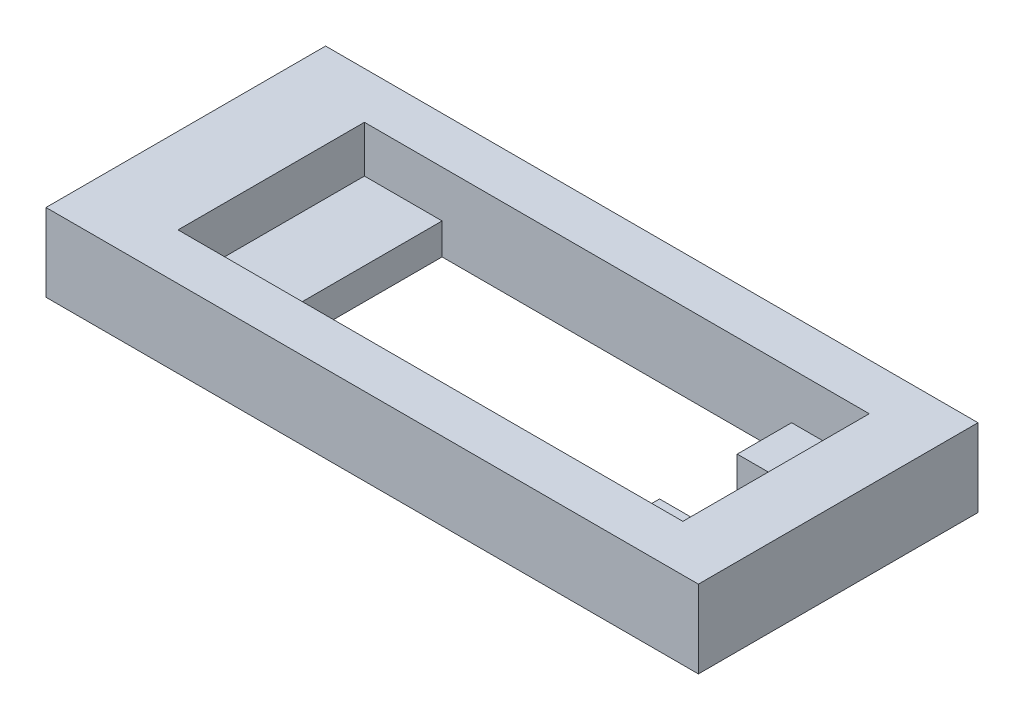
ISO-10303-21;
HEADER;
FILE_DESCRIPTION(('STEP AP214'),'2;1');
FILE_NAME('part.step','',(''),(''),'','','');
FILE_SCHEMA(('AUTOMOTIVE_DESIGN { 1 0 10303 214 1 1 1 1 }'));
ENDSEC;
DATA;
#1=APPLICATION_CONTEXT('core data for automotive mechanical design processes');
#2=APPLICATION_PROTOCOL_DEFINITION('international standard','automotive_design',2000,#1);
#3=PRODUCT_CONTEXT('',#1,'mechanical');
#4=PRODUCT('Part','Part','',(#3));
#5=PRODUCT_RELATED_PRODUCT_CATEGORY('part','',(#4));
#6=PRODUCT_DEFINITION_FORMATION('','',#4);
#7=PRODUCT_DEFINITION_CONTEXT('part definition',#1,'design');
#8=PRODUCT_DEFINITION('design','',#6,#7);
#9=PRODUCT_DEFINITION_SHAPE('','',#8);
#10=(LENGTH_UNIT() NAMED_UNIT(*) SI_UNIT(.MILLI.,.METRE.));
#11=(NAMED_UNIT(*) PLANE_ANGLE_UNIT() SI_UNIT($,.RADIAN.));
#12=(NAMED_UNIT(*) SI_UNIT($,.STERADIAN.) SOLID_ANGLE_UNIT());
#13=UNCERTAINTY_MEASURE_WITH_UNIT(LENGTH_MEASURE(1.E-05),#10,'distance_accuracy_value','');
#14=(GEOMETRIC_REPRESENTATION_CONTEXT(3) GLOBAL_UNCERTAINTY_ASSIGNED_CONTEXT((#13)) GLOBAL_UNIT_ASSIGNED_CONTEXT((#10,
#11,#12)) REPRESENTATION_CONTEXT('',''));
#15=CARTESIAN_POINT('',(0.,0.,0.));
#16=DIRECTION('',(0.,0.,1.));
#17=DIRECTION('',(1.,0.,0.));
#18=AXIS2_PLACEMENT_3D('',#15,#16,#17);
#19=CARTESIAN_POINT('',(0.,-3.,0.));
#20=DIRECTION('',(0.,-1.,0.));
#21=DIRECTION('',(1.,0.,0.));
#22=AXIS2_PLACEMENT_3D('',#19,#20,#21);
#23=PLANE('',#22);
#24=DIRECTION('',(0.,0.,-1.));
#25=VECTOR('',#24,1.);
#26=CARTESIAN_POINT('',(12.,-3.,3.));
#27=LINE('',#26,#25);
#28=CARTESIAN_POINT('',(12.,-3.,6.50000000000001));
#29=VERTEX_POINT('',#28);
#30=CARTESIAN_POINT('',(12.,-3.,3.));
#31=VERTEX_POINT('',#30);
#32=EDGE_CURVE('E185',#29,#31,#27,.T.);
#33=ORIENTED_EDGE('',*,*,#32,.F.);
#34=DIRECTION('',(-1.,0.,0.));
#35=VECTOR('',#34,1.);
#36=CARTESIAN_POINT('',(17.,-3.,6.50000000000001));
#37=LINE('',#36,#35);
#38=CARTESIAN_POINT('',(17.,-3.,6.50000000000001));
#39=VERTEX_POINT('',#38);
#40=EDGE_CURVE('E168',#39,#29,#37,.T.);
#41=ORIENTED_EDGE('',*,*,#40,.F.);
#42=DIRECTION('',(0.,0.,-1.));
#43=VECTOR('',#42,1.);
#44=CARTESIAN_POINT('',(17.,-3.,3.));
#45=LINE('',#44,#43);
#46=CARTESIAN_POINT('',(17.,-3.,3.));
#47=VERTEX_POINT('',#46);
#48=EDGE_CURVE('E220',#39,#47,#45,.T.);
#49=ORIENTED_EDGE('',*,*,#48,.T.);
#50=DIRECTION('',(-1.,0.,0.));
#51=VECTOR('',#50,1.);
#52=CARTESIAN_POINT('',(17.,-3.,3.));
#53=LINE('',#52,#51);
#54=EDGE_CURVE('E224',#47,#31,#53,.T.);
#55=ORIENTED_EDGE('',*,*,#54,.T.);
#56=EDGE_LOOP('',(#33,#41,#49,#55));
#57=FACE_BOUND('',#56,.T.);
#58=ADVANCED_FACE('F45',(#57),#23,.F.);
#59=CARTESIAN_POINT('',(12.,-5.00907777029563,3.));
#60=DIRECTION('',(1.,0.,0.));
#61=DIRECTION('',(0.,0.,-1.));
#62=AXIS2_PLACEMENT_3D('',#59,#60,#61);
#63=PLANE('',#62);
#64=DIRECTION('',(0.,0.,1.));
#65=VECTOR('',#64,1.);
#66=CARTESIAN_POINT('',(12.,-5.00807777029562,3.));
#67=LINE('',#66,#65);
#68=CARTESIAN_POINT('',(12.,-5.00807777029562,3.));
#69=VERTEX_POINT('',#68);
#70=CARTESIAN_POINT('',(12.,-5.00807777029562,6.50000000000001));
#71=VERTEX_POINT('',#70);
#72=EDGE_CURVE('E191',#69,#71,#67,.T.);
#73=ORIENTED_EDGE('',*,*,#72,.T.);
#74=DIRECTION('',(0.,1.,0.));
#75=VECTOR('',#74,1.);
#76=CARTESIAN_POINT('',(12.,-5.00907777029563,6.50000000000001));
#77=LINE('',#76,#75);
#78=EDGE_CURVE('E555',#71,#29,#77,.T.);
#79=ORIENTED_EDGE('',*,*,#78,.T.);
#80=ORIENTED_EDGE('',*,*,#32,.T.);
#81=DIRECTION('',(0.,1.,0.));
#82=VECTOR('',#81,1.);
#83=CARTESIAN_POINT('',(12.,-5.00907777029563,3.));
#84=LINE('',#83,#82);
#85=EDGE_CURVE('E189',#69,#31,#84,.T.);
#86=ORIENTED_EDGE('',*,*,#85,.F.);
#87=EDGE_LOOP('',(#73,#79,#80,#86));
#88=FACE_BOUND('',#87,.T.);
#89=ADVANCED_FACE('F320',(#88),#63,.F.);
#90=CARTESIAN_POINT('',(17.,-3.,15.));
#91=VERTEX_POINT('',#90);
#92=CARTESIAN_POINT('',(17.,-3.,11.5));
#93=VERTEX_POINT('',#92);
#94=EDGE_CURVE('E176',#91,#93,#45,.T.);
#95=ORIENTED_EDGE('',*,*,#94,.T.);
#96=DIRECTION('',(1.,0.,0.));
#97=VECTOR('',#96,1.);
#98=CARTESIAN_POINT('',(17.,-3.,11.5));
#99=LINE('',#98,#97);
#100=CARTESIAN_POINT('',(12.,-3.,11.5));
#101=VERTEX_POINT('',#100);
#102=EDGE_CURVE('E161',#101,#93,#99,.T.);
#103=ORIENTED_EDGE('',*,*,#102,.F.);
#104=CARTESIAN_POINT('',(12.,-3.,15.));
#105=VERTEX_POINT('',#104);
#106=EDGE_CURVE('E173',#105,#101,#27,.T.);
#107=ORIENTED_EDGE('',*,*,#106,.F.);
#108=DIRECTION('',(1.,0.,0.));
#109=VECTOR('',#108,1.);
#110=CARTESIAN_POINT('',(17.,-3.,15.));
#111=LINE('',#110,#109);
#112=EDGE_CURVE('E214',#105,#91,#111,.T.);
#113=ORIENTED_EDGE('',*,*,#112,.T.);
#114=EDGE_LOOP('',(#95,#103,#107,#113));
#115=FACE_BOUND('',#114,.T.);
#116=ADVANCED_FACE('F172',(#115),#23,.F.);
#117=DIRECTION('',(0.,0.,1.));
#118=VECTOR('',#117,1.);
#119=CARTESIAN_POINT('',(-10.5,-3.,3.));
#120=LINE('',#119,#118);
#121=CARTESIAN_POINT('',(-10.5,-3.,3.));
#122=VERTEX_POINT('',#121);
#123=CARTESIAN_POINT('',(-10.5,-3.,15.));
#124=VERTEX_POINT('',#123);
#125=EDGE_CURVE('E184',#122,#124,#120,.T.);
#126=ORIENTED_EDGE('',*,*,#125,.F.);
#127=CARTESIAN_POINT('',(-15.5,-3.,3.));
#128=VERTEX_POINT('',#127);
#129=EDGE_CURVE('E223',#122,#128,#53,.T.);
#130=ORIENTED_EDGE('',*,*,#129,.T.);
#131=DIRECTION('',(0.,0.,1.));
#132=VECTOR('',#131,1.);
#133=CARTESIAN_POINT('',(-15.5,-3.,3.));
#134=LINE('',#133,#132);
#135=CARTESIAN_POINT('',(-15.5,-3.,15.));
#136=VERTEX_POINT('',#135);
#137=EDGE_CURVE('E210',#128,#136,#134,.T.);
#138=ORIENTED_EDGE('',*,*,#137,.T.);
#139=EDGE_CURVE('E216',#136,#124,#111,.T.);
#140=ORIENTED_EDGE('',*,*,#139,.T.);
#141=EDGE_LOOP('',(#126,#130,#138,#140));
#142=FACE_BOUND('',#141,.T.);
#143=ADVANCED_FACE('F317',(#142),#23,.F.);
#144=CARTESIAN_POINT('',(21.,0.,18.));
#145=DIRECTION('',(0.,-1.,0.));
#146=DIRECTION('',(1.,0.,0.));
#147=AXIS2_PLACEMENT_3D('',#144,#145,#146);
#148=PLANE('',#147);
#149=DIRECTION('',(1.,0.,0.));
#150=VECTOR('',#149,1.);
#151=CARTESIAN_POINT('',(17.,0.,15.));
#152=LINE('',#151,#150);
#153=CARTESIAN_POINT('',(-15.5,0.,15.));
#154=VERTEX_POINT('',#153);
#155=CARTESIAN_POINT('',(17.,0.,15.));
#156=VERTEX_POINT('',#155);
#157=EDGE_CURVE('E231',#154,#156,#152,.T.);
#158=ORIENTED_EDGE('',*,*,#157,.F.);
#159=DIRECTION('',(0.,0.,1.));
#160=VECTOR('',#159,1.);
#161=CARTESIAN_POINT('',(-15.5,0.,3.));
#162=LINE('',#161,#160);
#163=CARTESIAN_POINT('',(-15.5,0.,3.));
#164=VERTEX_POINT('',#163);
#165=EDGE_CURVE('E209',#164,#154,#162,.T.);
#166=ORIENTED_EDGE('',*,*,#165,.F.);
#167=DIRECTION('',(-1.,0.,0.));
#168=VECTOR('',#167,1.);
#169=CARTESIAN_POINT('',(17.,0.,3.));
#170=LINE('',#169,#168);
#171=CARTESIAN_POINT('',(17.,0.,3.));
#172=VERTEX_POINT('',#171);
#173=EDGE_CURVE('E215',#172,#164,#170,.T.);
#174=ORIENTED_EDGE('',*,*,#173,.F.);
#175=DIRECTION('',(0.,0.,-1.));
#176=VECTOR('',#175,1.);
#177=CARTESIAN_POINT('',(17.,0.,3.));
#178=LINE('',#177,#176);
#179=EDGE_CURVE('E235',#156,#172,#178,.T.);
#180=ORIENTED_EDGE('',*,*,#179,.F.);
#181=EDGE_LOOP('',(#158,#166,#174,#180));
#182=FACE_BOUND('',#181,.T.);
#183=DIRECTION('',(-1.,0.,0.));
#184=VECTOR('',#183,1.);
#185=CARTESIAN_POINT('',(21.,0.,0.));
#186=LINE('',#185,#184);
#187=CARTESIAN_POINT('',(21.,0.,0.));
#188=VERTEX_POINT('',#187);
#189=CARTESIAN_POINT('',(-21.,0.,0.));
#190=VERTEX_POINT('',#189);
#191=EDGE_CURVE('E245',#188,#190,#186,.T.);
#192=ORIENTED_EDGE('',*,*,#191,.T.);
#193=DIRECTION('',(0.,0.,-1.));
#194=VECTOR('',#193,1.);
#195=CARTESIAN_POINT('',(-21.,0.,18.));
#196=LINE('',#195,#194);
#197=CARTESIAN_POINT('',(-21.,0.,18.));
#198=VERTEX_POINT('',#197);
#199=EDGE_CURVE('E11',#198,#190,#196,.T.);
#200=ORIENTED_EDGE('',*,*,#199,.F.);
#201=DIRECTION('',(-1.,0.,0.));
#202=VECTOR('',#201,1.);
#203=CARTESIAN_POINT('',(21.,0.,18.));
#204=LINE('',#203,#202);
#205=CARTESIAN_POINT('',(21.,0.,18.));
#206=VERTEX_POINT('',#205);
#207=EDGE_CURVE('E255',#206,#198,#204,.T.);
#208=ORIENTED_EDGE('',*,*,#207,.F.);
#209=DIRECTION('',(0.,0.,-1.));
#210=VECTOR('',#209,1.);
#211=CARTESIAN_POINT('',(21.,0.,18.));
#212=LINE('',#211,#210);
#213=EDGE_CURVE('E269',#206,#188,#212,.T.);
#214=ORIENTED_EDGE('',*,*,#213,.T.);
#215=EDGE_LOOP('',(#192,#200,#208,#214));
#216=FACE_BOUND('',#215,.T.);
#217=ADVANCED_FACE('F47',(#182,#216),#148,.F.);
#218=CARTESIAN_POINT('',(-21.,0.,18.));
#219=DIRECTION('',(1.,0.,0.));
#220=DIRECTION('',(0.,1.,0.));
#221=AXIS2_PLACEMENT_3D('',#218,#219,#220);
#222=PLANE('',#221);
#223=DIRECTION('',(0.,-1.,0.));
#224=VECTOR('',#223,1.);
#225=CARTESIAN_POINT('',(-21.,0.,0.));
#226=LINE('',#225,#224);
#227=CARTESIAN_POINT('',(-21.,-5.00807777029563,0.));
#228=VERTEX_POINT('',#227);
#229=EDGE_CURVE('E273',#190,#228,#226,.T.);
#230=ORIENTED_EDGE('',*,*,#229,.T.);
#231=DIRECTION('',(0.,0.,-1.));
#232=VECTOR('',#231,1.);
#233=CARTESIAN_POINT('',(-21.,-5.00807777029563,18.));
#234=LINE('',#233,#232);
#235=CARTESIAN_POINT('',(-21.,-5.00807777029563,18.));
#236=VERTEX_POINT('',#235);
#237=EDGE_CURVE('E54',#236,#228,#234,.T.);
#238=ORIENTED_EDGE('',*,*,#237,.F.);
#239=DIRECTION('',(0.,-1.,0.));
#240=VECTOR('',#239,1.);
#241=CARTESIAN_POINT('',(-21.,0.,18.));
#242=LINE('',#241,#240);
#243=EDGE_CURVE('E259',#198,#236,#242,.T.);
#244=ORIENTED_EDGE('',*,*,#243,.F.);
#245=ORIENTED_EDGE('',*,*,#199,.T.);
#246=EDGE_LOOP('',(#230,#238,#244,#245));
#247=FACE_BOUND('',#246,.T.);
#248=ADVANCED_FACE('F309',(#247),#222,.F.);
#249=CARTESIAN_POINT('',(-21.,-5.00807777029563,18.));
#250=DIRECTION('',(0.,1.,0.));
#251=DIRECTION('',(-1.,0.,0.));
#252=AXIS2_PLACEMENT_3D('',#249,#250,#251);
#253=PLANE('',#252);
#254=DIRECTION('',(0.,0.,1.));
#255=VECTOR('',#254,1.);
#256=CARTESIAN_POINT('',(17.,-5.00807777029562,6.50000000000001));
#257=LINE('',#256,#255);
#258=CARTESIAN_POINT('',(17.,-5.00807777029562,6.50000000000001));
#259=VERTEX_POINT('',#258);
#260=CARTESIAN_POINT('',(17.,-5.00807777029562,11.5));
#261=VERTEX_POINT('',#260);
#262=EDGE_CURVE('E559',#259,#261,#257,.T.);
#263=ORIENTED_EDGE('',*,*,#262,.F.);
#264=DIRECTION('',(1.,0.,0.));
#265=VECTOR('',#264,1.);
#266=CARTESIAN_POINT('',(17.,-5.00807777029562,6.50000000000001));
#267=LINE('',#266,#265);
#268=EDGE_CURVE('E178',#71,#259,#267,.T.);
#269=ORIENTED_EDGE('',*,*,#268,.F.);
#270=ORIENTED_EDGE('',*,*,#72,.F.);
#271=DIRECTION('',(1.,0.,0.));
#272=VECTOR('',#271,1.);
#273=CARTESIAN_POINT('',(-10.5,-5.00807777029563,3.));
#274=LINE('',#273,#272);
#275=CARTESIAN_POINT('',(-10.5,-5.00807777029563,3.));
#276=VERTEX_POINT('',#275);
#277=EDGE_CURVE('E197',#276,#69,#274,.T.);
#278=ORIENTED_EDGE('',*,*,#277,.F.);
#279=DIRECTION('',(0.,0.,-1.));
#280=VECTOR('',#279,1.);
#281=CARTESIAN_POINT('',(-10.5,-5.00807777029563,3.));
#282=LINE('',#281,#280);
#283=CARTESIAN_POINT('',(-10.5,-5.00807777029563,15.));
#284=VERTEX_POINT('',#283);
#285=EDGE_CURVE('E575',#284,#276,#282,.T.);
#286=ORIENTED_EDGE('',*,*,#285,.F.);
#287=DIRECTION('',(-1.,0.,0.));
#288=VECTOR('',#287,1.);
#289=CARTESIAN_POINT('',(-10.5,-5.00807777029563,15.));
#290=LINE('',#289,#288);
#291=CARTESIAN_POINT('',(12.,-5.00807777029562,15.));
#292=VERTEX_POINT('',#291);
#293=EDGE_CURVE('E577',#292,#284,#290,.T.);
#294=ORIENTED_EDGE('',*,*,#293,.F.);
#295=CARTESIAN_POINT('',(12.,-5.00807777029562,11.5));
#296=VERTEX_POINT('',#295);
#297=EDGE_CURVE('E580',#296,#292,#67,.T.);
#298=ORIENTED_EDGE('',*,*,#297,.F.);
#299=DIRECTION('',(-1.,0.,0.));
#300=VECTOR('',#299,1.);
#301=CARTESIAN_POINT('',(17.,-5.00807777029562,11.5));
#302=LINE('',#301,#300);
#303=EDGE_CURVE('E61',#261,#296,#302,.T.);
#304=ORIENTED_EDGE('',*,*,#303,.F.);
#305=EDGE_LOOP('',(#263,#269,#270,#278,#286,#294,#298,#304));
#306=FACE_BOUND('',#305,.T.);
#307=DIRECTION('',(1.,0.,0.));
#308=VECTOR('',#307,1.);
#309=CARTESIAN_POINT('',(-21.,-5.00807777029563,0.));
#310=LINE('',#309,#308);
#311=CARTESIAN_POINT('',(21.,-5.00807777029562,0.));
#312=VERTEX_POINT('',#311);
#313=EDGE_CURVE('E276',#228,#312,#310,.T.);
#314=ORIENTED_EDGE('',*,*,#313,.T.);
#315=DIRECTION('',(0.,0.,-1.));
#316=VECTOR('',#315,1.);
#317=CARTESIAN_POINT('',(21.,-5.00807777029562,18.));
#318=LINE('',#317,#316);
#319=CARTESIAN_POINT('',(21.,-5.00807777029562,18.));
#320=VERTEX_POINT('',#319);
#321=EDGE_CURVE('E284',#320,#312,#318,.T.);
#322=ORIENTED_EDGE('',*,*,#321,.F.);
#323=DIRECTION('',(1.,0.,0.));
#324=VECTOR('',#323,1.);
#325=CARTESIAN_POINT('',(-21.,-5.00807777029563,18.));
#326=LINE('',#325,#324);
#327=EDGE_CURVE('E263',#236,#320,#326,.T.);
#328=ORIENTED_EDGE('',*,*,#327,.F.);
#329=ORIENTED_EDGE('',*,*,#237,.T.);
#330=EDGE_LOOP('',(#314,#322,#328,#329));
#331=FACE_BOUND('',#330,.T.);
#332=ADVANCED_FACE('F293',(#306,#331),#253,.F.);
#333=CARTESIAN_POINT('',(21.,-5.00807777029562,18.));
#334=DIRECTION('',(-1.,0.,0.));
#335=DIRECTION('',(0.,-1.,0.));
#336=AXIS2_PLACEMENT_3D('',#333,#334,#335);
#337=PLANE('',#336);
#338=DIRECTION('',(0.,1.,0.));
#339=VECTOR('',#338,1.);
#340=CARTESIAN_POINT('',(21.,-5.00807777029562,0.));
#341=LINE('',#340,#339);
#342=EDGE_CURVE('E260',#312,#188,#341,.T.);
#343=ORIENTED_EDGE('',*,*,#342,.T.);
#344=ORIENTED_EDGE('',*,*,#213,.F.);
#345=DIRECTION('',(0.,1.,0.));
#346=VECTOR('',#345,1.);
#347=CARTESIAN_POINT('',(21.,-5.00807777029562,18.));
#348=LINE('',#347,#346);
#349=EDGE_CURVE('E266',#320,#206,#348,.T.);
#350=ORIENTED_EDGE('',*,*,#349,.F.);
#351=ORIENTED_EDGE('',*,*,#321,.T.);
#352=EDGE_LOOP('',(#343,#344,#350,#351));
#353=FACE_BOUND('',#352,.T.);
#354=ADVANCED_FACE('F302',(#353),#337,.F.);
#355=CARTESIAN_POINT('',(0.,0.,18.));
#356=DIRECTION('',(0.,0.,1.));
#357=DIRECTION('',(1.,0.,0.));
#358=AXIS2_PLACEMENT_3D('',#355,#356,#357);
#359=PLANE('',#358);
#360=ORIENTED_EDGE('',*,*,#207,.T.);
#361=ORIENTED_EDGE('',*,*,#243,.T.);
#362=ORIENTED_EDGE('',*,*,#327,.T.);
#363=ORIENTED_EDGE('',*,*,#349,.T.);
#364=EDGE_LOOP('',(#360,#361,#362,#363));
#365=FACE_BOUND('',#364,.T.);
#366=ADVANCED_FACE('F308',(#365),#359,.T.);
#367=CARTESIAN_POINT('',(0.,0.,0.));
#368=DIRECTION('',(0.,0.,1.));
#369=DIRECTION('',(1.,0.,0.));
#370=AXIS2_PLACEMENT_3D('',#367,#368,#369);
#371=PLANE('',#370);
#372=ORIENTED_EDGE('',*,*,#191,.F.);
#373=ORIENTED_EDGE('',*,*,#342,.F.);
#374=ORIENTED_EDGE('',*,*,#313,.F.);
#375=ORIENTED_EDGE('',*,*,#229,.F.);
#376=EDGE_LOOP('',(#372,#373,#374,#375));
#377=FACE_BOUND('',#376,.T.);
#378=ADVANCED_FACE('F299',(#377),#371,.F.);
#379=CARTESIAN_POINT('',(-15.5,-3.,3.));
#380=DIRECTION('',(-1.,0.,0.));
#381=DIRECTION('',(0.,0.,1.));
#382=AXIS2_PLACEMENT_3D('',#379,#380,#381);
#383=PLANE('',#382);
#384=ORIENTED_EDGE('',*,*,#165,.T.);
#385=DIRECTION('',(0.,1.,0.));
#386=VECTOR('',#385,1.);
#387=CARTESIAN_POINT('',(-15.5,-3.,15.));
#388=LINE('',#387,#386);
#389=EDGE_CURVE('E228',#136,#154,#388,.T.);
#390=ORIENTED_EDGE('',*,*,#389,.F.);
#391=ORIENTED_EDGE('',*,*,#137,.F.);
#392=DIRECTION('',(0.,1.,0.));
#393=VECTOR('',#392,1.);
#394=CARTESIAN_POINT('',(-15.5,-3.,3.));
#395=LINE('',#394,#393);
#396=EDGE_CURVE('E242',#128,#164,#395,.T.);
#397=ORIENTED_EDGE('',*,*,#396,.T.);
#398=EDGE_LOOP('',(#384,#390,#391,#397));
#399=FACE_BOUND('',#398,.T.);
#400=ADVANCED_FACE('F382',(#399),#383,.F.);
#401=CARTESIAN_POINT('',(17.,-3.,3.));
#402=DIRECTION('',(0.,0.,-1.));
#403=DIRECTION('',(-1.,0.,0.));
#404=AXIS2_PLACEMENT_3D('',#401,#402,#403);
#405=PLANE('',#404);
#406=ORIENTED_EDGE('',*,*,#173,.T.);
#407=ORIENTED_EDGE('',*,*,#396,.F.);
#408=ORIENTED_EDGE('',*,*,#129,.F.);
#409=DIRECTION('',(0.,1.,0.));
#410=VECTOR('',#409,1.);
#411=CARTESIAN_POINT('',(-10.5,-5.00907777029563,3.));
#412=LINE('',#411,#410);
#413=EDGE_CURVE('E69',#276,#122,#412,.T.);
#414=ORIENTED_EDGE('',*,*,#413,.F.);
#415=ORIENTED_EDGE('',*,*,#277,.T.);
#416=ORIENTED_EDGE('',*,*,#85,.T.);
#417=ORIENTED_EDGE('',*,*,#54,.F.);
#418=DIRECTION('',(0.,1.,0.));
#419=VECTOR('',#418,1.);
#420=CARTESIAN_POINT('',(17.,-3.,3.));
#421=LINE('',#420,#419);
#422=EDGE_CURVE('E246',#47,#172,#421,.T.);
#423=ORIENTED_EDGE('',*,*,#422,.T.);
#424=EDGE_LOOP('',(#406,#407,#408,#414,#415,#416,#417,#423));
#425=FACE_BOUND('',#424,.T.);
#426=ADVANCED_FACE('F390',(#425),#405,.F.);
#427=CARTESIAN_POINT('',(17.,-3.,3.));
#428=DIRECTION('',(1.,0.,0.));
#429=DIRECTION('',(0.,1.,0.));
#430=AXIS2_PLACEMENT_3D('',#427,#428,#429);
#431=PLANE('',#430);
#432=ORIENTED_EDGE('',*,*,#179,.T.);
#433=ORIENTED_EDGE('',*,*,#422,.F.);
#434=ORIENTED_EDGE('',*,*,#48,.F.);
#435=DIRECTION('',(0.,1.,0.));
#436=VECTOR('',#435,1.);
#437=CARTESIAN_POINT('',(17.,-5.00907777029563,6.50000000000001));
#438=LINE('',#437,#436);
#439=EDGE_CURVE('E552',#259,#39,#438,.T.);
#440=ORIENTED_EDGE('',*,*,#439,.F.);
#441=ORIENTED_EDGE('',*,*,#262,.T.);
#442=DIRECTION('',(0.,1.,0.));
#443=VECTOR('',#442,1.);
#444=CARTESIAN_POINT('',(17.,-5.00907777029563,11.5));
#445=LINE('',#444,#443);
#446=EDGE_CURVE('E167',#261,#93,#445,.T.);
#447=ORIENTED_EDGE('',*,*,#446,.T.);
#448=ORIENTED_EDGE('',*,*,#94,.F.);
#449=DIRECTION('',(0.,1.,0.));
#450=VECTOR('',#449,1.);
#451=CARTESIAN_POINT('',(17.,-3.,15.));
#452=LINE('',#451,#450);
#453=EDGE_CURVE('E249',#91,#156,#452,.T.);
#454=ORIENTED_EDGE('',*,*,#453,.T.);
#455=EDGE_LOOP('',(#432,#433,#434,#440,#441,#447,#448,#454));
#456=FACE_BOUND('',#455,.T.);
#457=ADVANCED_FACE('F400',(#456),#431,.F.);
#458=CARTESIAN_POINT('',(17.,-3.,15.));
#459=DIRECTION('',(0.,0.,1.));
#460=DIRECTION('',(1.,0.,0.));
#461=AXIS2_PLACEMENT_3D('',#458,#459,#460);
#462=PLANE('',#461);
#463=ORIENTED_EDGE('',*,*,#157,.T.);
#464=ORIENTED_EDGE('',*,*,#453,.F.);
#465=ORIENTED_EDGE('',*,*,#112,.F.);
#466=DIRECTION('',(0.,1.,0.));
#467=VECTOR('',#466,1.);
#468=CARTESIAN_POINT('',(12.,-5.00907777029563,15.));
#469=LINE('',#468,#467);
#470=EDGE_CURVE('E182',#292,#105,#469,.T.);
#471=ORIENTED_EDGE('',*,*,#470,.F.);
#472=ORIENTED_EDGE('',*,*,#293,.T.);
#473=DIRECTION('',(0.,1.,0.));
#474=VECTOR('',#473,1.);
#475=CARTESIAN_POINT('',(-10.5,-5.00907777029563,15.));
#476=LINE('',#475,#474);
#477=EDGE_CURVE('E198',#284,#124,#476,.T.);
#478=ORIENTED_EDGE('',*,*,#477,.T.);
#479=ORIENTED_EDGE('',*,*,#139,.F.);
#480=ORIENTED_EDGE('',*,*,#389,.T.);
#481=EDGE_LOOP('',(#463,#464,#465,#471,#472,#478,#479,#480));
#482=FACE_BOUND('',#481,.T.);
#483=ADVANCED_FACE('F409',(#482),#462,.F.);
#484=ORIENTED_EDGE('',*,*,#106,.T.);
#485=DIRECTION('',(0.,1.,0.));
#486=VECTOR('',#485,1.);
#487=CARTESIAN_POINT('',(12.,-5.00907777029563,11.5));
#488=LINE('',#487,#486);
#489=EDGE_CURVE('E158',#296,#101,#488,.T.);
#490=ORIENTED_EDGE('',*,*,#489,.F.);
#491=ORIENTED_EDGE('',*,*,#297,.T.);
#492=ORIENTED_EDGE('',*,*,#470,.T.);
#493=EDGE_LOOP('',(#484,#490,#491,#492));
#494=FACE_BOUND('',#493,.T.);
#495=ADVANCED_FACE('F180',(#494),#63,.F.);
#496=CARTESIAN_POINT('',(-10.5,-5.00907777029563,3.));
#497=DIRECTION('',(-1.,0.,0.));
#498=DIRECTION('',(0.,0.,1.));
#499=AXIS2_PLACEMENT_3D('',#496,#497,#498);
#500=PLANE('',#499);
#501=ORIENTED_EDGE('',*,*,#285,.T.);
#502=ORIENTED_EDGE('',*,*,#413,.T.);
#503=ORIENTED_EDGE('',*,*,#125,.T.);
#504=ORIENTED_EDGE('',*,*,#477,.F.);
#505=EDGE_LOOP('',(#501,#502,#503,#504));
#506=FACE_BOUND('',#505,.T.);
#507=ADVANCED_FACE('F428',(#506),#500,.F.);
#508=CARTESIAN_POINT('',(17.,-5.00907777029563,6.50000000000001));
#509=DIRECTION('',(0.,0.,-1.));
#510=DIRECTION('',(-1.,0.,0.));
#511=AXIS2_PLACEMENT_3D('',#508,#509,#510);
#512=PLANE('',#511);
#513=ORIENTED_EDGE('',*,*,#268,.T.);
#514=ORIENTED_EDGE('',*,*,#439,.T.);
#515=ORIENTED_EDGE('',*,*,#40,.T.);
#516=ORIENTED_EDGE('',*,*,#78,.F.);
#517=EDGE_LOOP('',(#513,#514,#515,#516));
#518=FACE_BOUND('',#517,.T.);
#519=ADVANCED_FACE('F436',(#518),#512,.F.);
#520=CARTESIAN_POINT('',(17.,-5.00907777029563,11.5));
#521=DIRECTION('',(0.,0.,1.));
#522=DIRECTION('',(0.,-1.,0.));
#523=AXIS2_PLACEMENT_3D('',#520,#521,#522);
#524=PLANE('',#523);
#525=ORIENTED_EDGE('',*,*,#303,.T.);
#526=ORIENTED_EDGE('',*,*,#489,.T.);
#527=ORIENTED_EDGE('',*,*,#102,.T.);
#528=ORIENTED_EDGE('',*,*,#446,.F.);
#529=EDGE_LOOP('',(#525,#526,#527,#528));
#530=FACE_BOUND('',#529,.T.);
#531=ADVANCED_FACE('F160',(#530),#524,.F.);
#532=CLOSED_SHELL('',(#58,#89,#116,#143,#217,#248,#332,#354,#366,#378,#400,#426,#457,#483,#495,
#507,#519,#531));
#533=MANIFOLD_SOLID_BREP('B2',#532);
#534=ADVANCED_BREP_SHAPE_REPRESENTATION('',(#18,#533),#14);
#535=SHAPE_DEFINITION_REPRESENTATION(#9,#534);
ENDSEC;
END-ISO-10303-21;
